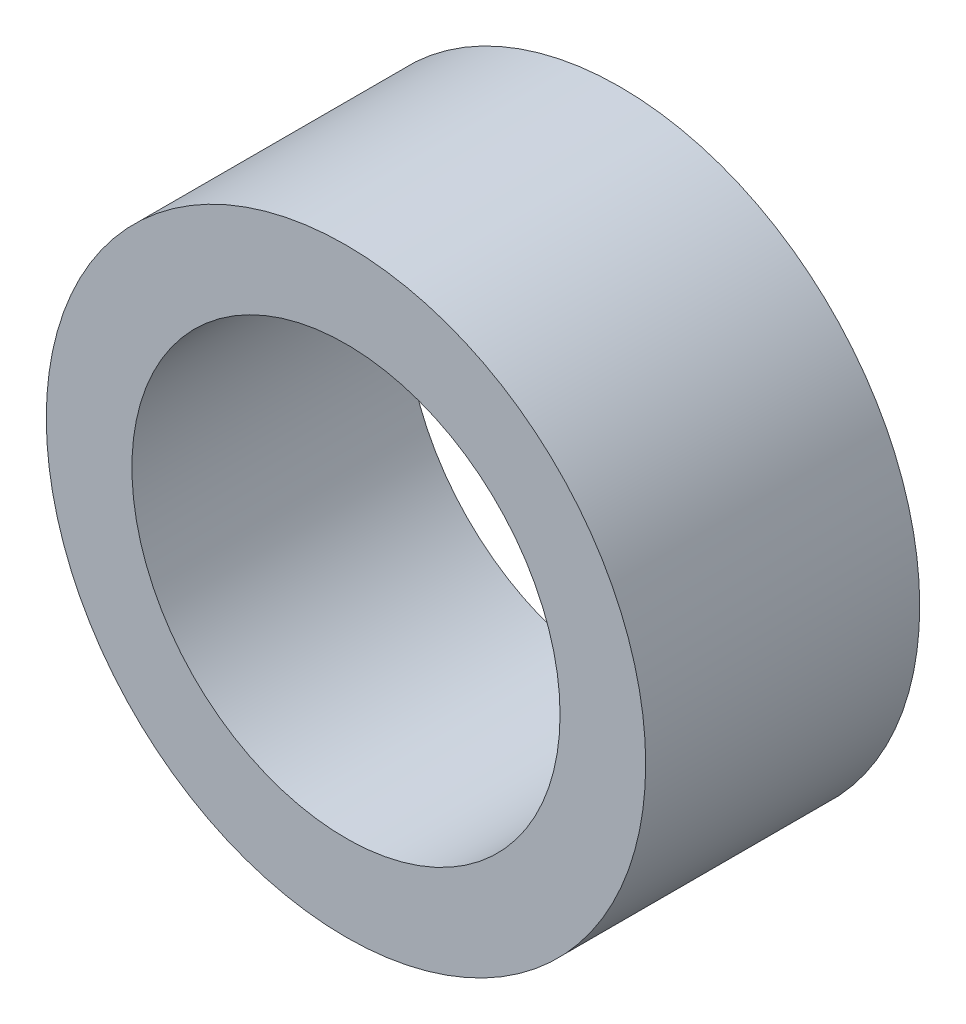
ISO-10303-21;
HEADER;
FILE_DESCRIPTION(('STEP AP214'),'2;1');
FILE_NAME('part.step','',(''),(''),'','','');
FILE_SCHEMA(('AUTOMOTIVE_DESIGN { 1 0 10303 214 1 1 1 1 }'));
ENDSEC;
DATA;
#1=APPLICATION_CONTEXT('core data for automotive mechanical design processes');
#2=APPLICATION_PROTOCOL_DEFINITION('international standard','automotive_design',2000,#1);
#3=PRODUCT_CONTEXT('',#1,'mechanical');
#4=PRODUCT('Part','Part','',(#3));
#5=PRODUCT_RELATED_PRODUCT_CATEGORY('part','',(#4));
#6=PRODUCT_DEFINITION_FORMATION('','',#4);
#7=PRODUCT_DEFINITION_CONTEXT('part definition',#1,'design');
#8=PRODUCT_DEFINITION('design','',#6,#7);
#9=PRODUCT_DEFINITION_SHAPE('','',#8);
#10=(LENGTH_UNIT() NAMED_UNIT(*) SI_UNIT(.MILLI.,.METRE.));
#11=(NAMED_UNIT(*) PLANE_ANGLE_UNIT() SI_UNIT($,.RADIAN.));
#12=(NAMED_UNIT(*) SI_UNIT($,.STERADIAN.) SOLID_ANGLE_UNIT());
#13=UNCERTAINTY_MEASURE_WITH_UNIT(LENGTH_MEASURE(1.E-05),#10,'distance_accuracy_value','');
#14=(GEOMETRIC_REPRESENTATION_CONTEXT(3) GLOBAL_UNCERTAINTY_ASSIGNED_CONTEXT((#13)) GLOBAL_UNIT_ASSIGNED_CONTEXT((#10,
#11,#12)) REPRESENTATION_CONTEXT('',''));
#15=CARTESIAN_POINT('',(0.,0.,0.));
#16=DIRECTION('',(0.,0.,1.));
#17=DIRECTION('',(1.,0.,0.));
#18=AXIS2_PLACEMENT_3D('',#15,#16,#17);
#19=CARTESIAN_POINT('',(0.,0.,6.985));
#20=DIRECTION('',(0.,0.,-1.));
#21=DIRECTION('',(-1.,0.,0.));
#22=AXIS2_PLACEMENT_3D('',#19,#20,#21);
#23=CYLINDRICAL_SURFACE('',#22,4.445);
#24=CARTESIAN_POINT('',(0.,0.,0.));
#25=DIRECTION('',(0.,0.,1.));
#26=DIRECTION('',(1.,0.,0.));
#27=AXIS2_PLACEMENT_3D('',#24,#25,#26);
#28=CIRCLE('',#27,4.445);
#29=CARTESIAN_POINT('',(4.445,0.,0.));
#30=VERTEX_POINT('',#29);
#31=EDGE_CURVE('E10',#30,#30,#28,.T.);
#32=ORIENTED_EDGE('',*,*,#31,.T.);
#33=EDGE_LOOP('',(#32));
#34=FACE_BOUND('',#33,.T.);
#35=CARTESIAN_POINT('',(0.,0.,4.064));
#36=DIRECTION('',(0.,0.,1.));
#37=DIRECTION('',(1.,0.,0.));
#38=AXIS2_PLACEMENT_3D('',#35,#36,#37);
#39=CIRCLE('',#38,4.445);
#40=CARTESIAN_POINT('',(4.445,0.,4.064));
#41=VERTEX_POINT('',#40);
#42=EDGE_CURVE('E54',#41,#41,#39,.T.);
#43=ORIENTED_EDGE('',*,*,#42,.F.);
#44=EDGE_LOOP('',(#43));
#45=FACE_BOUND('',#44,.T.);
#46=ADVANCED_FACE('F41',(#34,#45),#23,.T.);
#47=CARTESIAN_POINT('',(0.,0.,6.985));
#48=DIRECTION('',(0.,0.,-1.));
#49=DIRECTION('',(-1.,0.,0.));
#50=AXIS2_PLACEMENT_3D('',#47,#48,#49);
#51=CYLINDRICAL_SURFACE('',#50,3.175);
#52=CARTESIAN_POINT('',(0.,0.,0.));
#53=DIRECTION('',(0.,0.,1.));
#54=DIRECTION('',(1.,0.,0.));
#55=AXIS2_PLACEMENT_3D('',#52,#53,#54);
#56=CIRCLE('',#55,3.175);
#57=CARTESIAN_POINT('',(3.175,0.,0.));
#58=VERTEX_POINT('',#57);
#59=EDGE_CURVE('E48',#58,#58,#56,.T.);
#60=ORIENTED_EDGE('',*,*,#59,.F.);
#61=EDGE_LOOP('',(#60));
#62=FACE_BOUND('',#61,.T.);
#63=CARTESIAN_POINT('',(0.,0.,4.064));
#64=DIRECTION('',(0.,0.,1.));
#65=DIRECTION('',(1.,0.,0.));
#66=AXIS2_PLACEMENT_3D('',#63,#64,#65);
#67=CIRCLE('',#66,3.175);
#68=CARTESIAN_POINT('',(3.175,0.,4.064));
#69=VERTEX_POINT('',#68);
#70=EDGE_CURVE('E44',#69,#69,#67,.T.);
#71=ORIENTED_EDGE('',*,*,#70,.T.);
#72=EDGE_LOOP('',(#71));
#73=FACE_BOUND('',#72,.T.);
#74=ADVANCED_FACE('F61',(#62,#73),#51,.F.);
#75=CARTESIAN_POINT('',(0.,0.,0.));
#76=DIRECTION('',(0.,0.,1.));
#77=DIRECTION('',(1.,0.,0.));
#78=AXIS2_PLACEMENT_3D('',#75,#76,#77);
#79=PLANE('',#78);
#80=ORIENTED_EDGE('',*,*,#31,.F.);
#81=EDGE_LOOP('',(#80));
#82=FACE_BOUND('',#81,.T.);
#83=ORIENTED_EDGE('',*,*,#59,.T.);
#84=EDGE_LOOP('',(#83));
#85=FACE_BOUND('',#84,.T.);
#86=ADVANCED_FACE('F65',(#82,#85),#79,.F.);
#87=CARTESIAN_POINT('',(0.,0.,4.064));
#88=DIRECTION('',(0.,0.,1.));
#89=DIRECTION('',(1.,0.,0.));
#90=AXIS2_PLACEMENT_3D('',#87,#88,#89);
#91=PLANE('',#90);
#92=ORIENTED_EDGE('',*,*,#70,.F.);
#93=EDGE_LOOP('',(#92));
#94=FACE_BOUND('',#93,.T.);
#95=ORIENTED_EDGE('',*,*,#42,.T.);
#96=EDGE_LOOP('',(#95));
#97=FACE_BOUND('',#96,.T.);
#98=ADVANCED_FACE('F63',(#94,#97),#91,.T.);
#99=CLOSED_SHELL('',(#46,#74,#86,#98));
#100=MANIFOLD_SOLID_BREP('B2',#99);
#101=ADVANCED_BREP_SHAPE_REPRESENTATION('',(#18,#100),#14);
#102=SHAPE_DEFINITION_REPRESENTATION(#9,#101);
ENDSEC;
END-ISO-10303-21;
